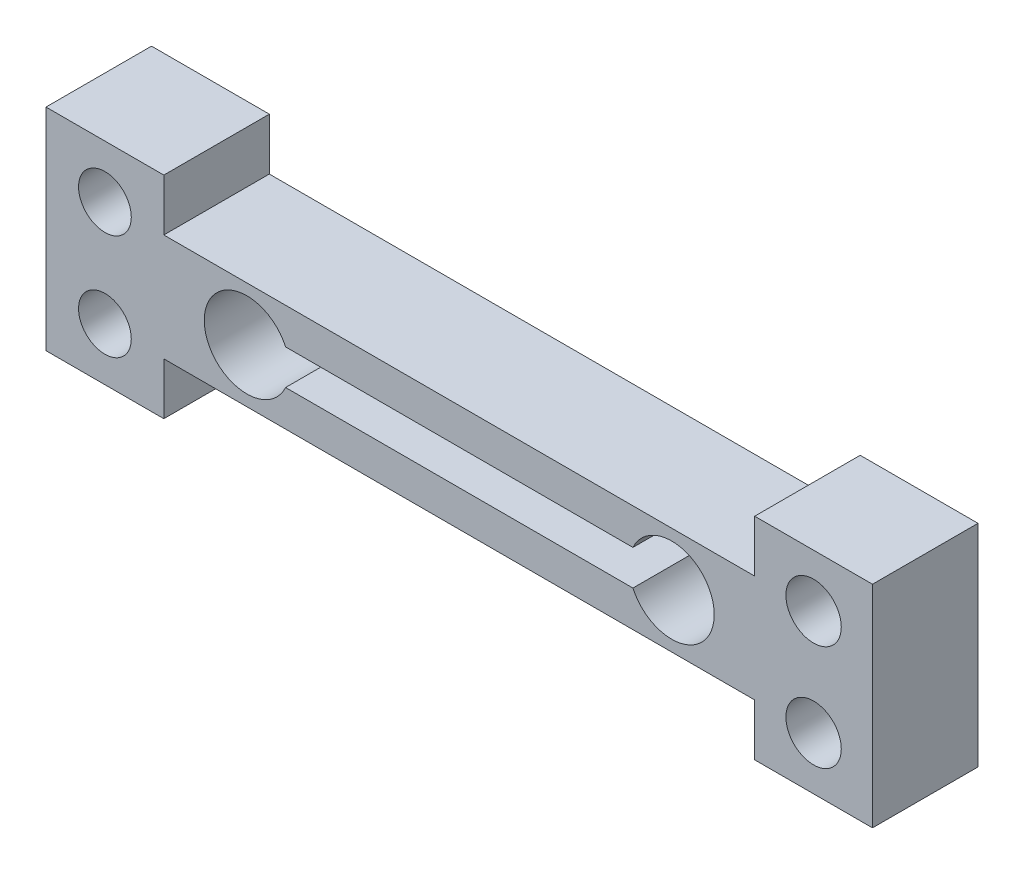
ISO-10303-21;
HEADER;
FILE_DESCRIPTION(('STEP AP214'),'2;1');
FILE_NAME('part.step','',(''),(''),'','','');
FILE_SCHEMA(('AUTOMOTIVE_DESIGN { 1 0 10303 214 1 1 1 1 }'));
ENDSEC;
DATA;
#1=APPLICATION_CONTEXT('core data for automotive mechanical design processes');
#2=APPLICATION_PROTOCOL_DEFINITION('international standard','automotive_design',2000,#1);
#3=PRODUCT_CONTEXT('',#1,'mechanical');
#4=PRODUCT('Part','Part','',(#3));
#5=PRODUCT_RELATED_PRODUCT_CATEGORY('part','',(#4));
#6=PRODUCT_DEFINITION_FORMATION('','',#4);
#7=PRODUCT_DEFINITION_CONTEXT('part definition',#1,'design');
#8=PRODUCT_DEFINITION('design','',#6,#7);
#9=PRODUCT_DEFINITION_SHAPE('','',#8);
#10=(LENGTH_UNIT() NAMED_UNIT(*) SI_UNIT(.MILLI.,.METRE.));
#11=(NAMED_UNIT(*) PLANE_ANGLE_UNIT() SI_UNIT($,.RADIAN.));
#12=(NAMED_UNIT(*) SI_UNIT($,.STERADIAN.) SOLID_ANGLE_UNIT());
#13=UNCERTAINTY_MEASURE_WITH_UNIT(LENGTH_MEASURE(1.E-05),#10,'distance_accuracy_value','');
#14=(GEOMETRIC_REPRESENTATION_CONTEXT(3) GLOBAL_UNCERTAINTY_ASSIGNED_CONTEXT((#13)) GLOBAL_UNIT_ASSIGNED_CONTEXT((#10,
#11,#12)) REPRESENTATION_CONTEXT('',''));
#15=CARTESIAN_POINT('',(0.,0.,0.));
#16=DIRECTION('',(0.,0.,1.));
#17=DIRECTION('',(1.,0.,0.));
#18=AXIS2_PLACEMENT_3D('',#15,#16,#17);
#19=CARTESIAN_POINT('',(0.,0.,3.));
#20=DIRECTION('',(0.,0.,1.));
#21=DIRECTION('',(1.,0.,0.));
#22=AXIS2_PLACEMENT_3D('',#19,#20,#21);
#23=PLANE('',#22);
#24=CARTESIAN_POINT('',(8.07,0.,3.));
#25=DIRECTION('',(0.,0.,1.));
#26=DIRECTION('',(1.,0.,0.));
#27=AXIS2_PLACEMENT_3D('',#24,#25,#26);
#28=CIRCLE('',#27,2.42);
#29=CARTESIAN_POINT('',(10.2737241206648,1.,3.));
#30=VERTEX_POINT('',#29);
#31=CARTESIAN_POINT('',(10.2737241206648,-1.,3.));
#32=VERTEX_POINT('',#31);
#33=EDGE_CURVE('E56',#30,#32,#28,.T.);
#34=ORIENTED_EDGE('',*,*,#33,.F.);
#35=DIRECTION('',(-1.,0.,0.));
#36=VECTOR('',#35,1.);
#37=CARTESIAN_POINT('',(10.2737241206648,1.,3.));
#38=LINE('',#37,#36);
#39=CARTESIAN_POINT('',(30.0262758793352,1.,3.));
#40=VERTEX_POINT('',#39);
#41=EDGE_CURVE('E172',#40,#30,#38,.T.);
#42=ORIENTED_EDGE('',*,*,#41,.F.);
#43=CARTESIAN_POINT('',(32.23,0.,3.));
#44=DIRECTION('',(0.,0.,1.));
#45=DIRECTION('',(1.,0.,0.));
#46=AXIS2_PLACEMENT_3D('',#43,#44,#45);
#47=CIRCLE('',#46,2.42);
#48=CARTESIAN_POINT('',(30.0262758793352,-0.999999999999999,3.));
#49=VERTEX_POINT('',#48);
#50=EDGE_CURVE('E175',#49,#40,#47,.T.);
#51=ORIENTED_EDGE('',*,*,#50,.F.);
#52=DIRECTION('',(1.,0.,0.));
#53=VECTOR('',#52,1.);
#54=CARTESIAN_POINT('',(10.2737241206648,-1.,3.));
#55=LINE('',#54,#53);
#56=EDGE_CURVE('E181',#32,#49,#55,.T.);
#57=ORIENTED_EDGE('',*,*,#56,.F.);
#58=EDGE_LOOP('',(#34,#42,#51,#57));
#59=FACE_BOUND('',#58,.T.);
#60=CARTESIAN_POINT('',(0.,3.,3.));
#61=DIRECTION('',(0.,0.,1.));
#62=DIRECTION('',(1.,0.,0.));
#63=AXIS2_PLACEMENT_3D('',#60,#61,#62);
#64=CIRCLE('',#63,1.5);
#65=CARTESIAN_POINT('',(1.5,3.,3.));
#66=VERTEX_POINT('',#65);
#67=EDGE_CURVE('E197',#66,#66,#64,.T.);
#68=ORIENTED_EDGE('',*,*,#67,.F.);
#69=EDGE_LOOP('',(#68));
#70=FACE_BOUND('',#69,.T.);
#71=CARTESIAN_POINT('',(40.3,3.,3.));
#72=DIRECTION('',(0.,0.,1.));
#73=DIRECTION('',(1.,0.,0.));
#74=AXIS2_PLACEMENT_3D('',#71,#72,#73);
#75=CIRCLE('',#74,1.575);
#76=CARTESIAN_POINT('',(41.875,3.,3.));
#77=VERTEX_POINT('',#76);
#78=EDGE_CURVE('E209',#77,#77,#75,.T.);
#79=ORIENTED_EDGE('',*,*,#78,.F.);
#80=EDGE_LOOP('',(#79));
#81=FACE_BOUND('',#80,.T.);
#82=DIRECTION('',(0.,1.,0.));
#83=VECTOR('',#82,1.);
#84=CARTESIAN_POINT('',(3.35,-3.05,3.));
#85=LINE('',#84,#83);
#86=CARTESIAN_POINT('',(3.35,-6.,3.));
#87=VERTEX_POINT('',#86);
#88=CARTESIAN_POINT('',(3.35,-3.05,3.));
#89=VERTEX_POINT('',#88);
#90=EDGE_CURVE('E215',#87,#89,#85,.T.);
#91=ORIENTED_EDGE('',*,*,#90,.T.);
#92=DIRECTION('',(1.,0.,0.));
#93=VECTOR('',#92,1.);
#94=CARTESIAN_POINT('',(3.35,-3.05,3.));
#95=LINE('',#94,#93);
#96=CARTESIAN_POINT('',(36.95,-3.05,3.));
#97=VERTEX_POINT('',#96);
#98=EDGE_CURVE('E218',#89,#97,#95,.T.);
#99=ORIENTED_EDGE('',*,*,#98,.T.);
#100=DIRECTION('',(0.,-1.,0.));
#101=VECTOR('',#100,1.);
#102=CARTESIAN_POINT('',(36.95,-6.,3.));
#103=LINE('',#102,#101);
#104=CARTESIAN_POINT('',(36.95,-6.,3.));
#105=VERTEX_POINT('',#104);
#106=EDGE_CURVE('E221',#97,#105,#103,.T.);
#107=ORIENTED_EDGE('',*,*,#106,.T.);
#108=DIRECTION('',(1.,0.,0.));
#109=VECTOR('',#108,1.);
#110=CARTESIAN_POINT('',(43.65,-6.,3.));
#111=LINE('',#110,#109);
#112=CARTESIAN_POINT('',(43.65,-6.,3.));
#113=VERTEX_POINT('',#112);
#114=EDGE_CURVE('E223',#105,#113,#111,.T.);
#115=ORIENTED_EDGE('',*,*,#114,.T.);
#116=DIRECTION('',(0.,1.,0.));
#117=VECTOR('',#116,1.);
#118=CARTESIAN_POINT('',(43.65,-6.,3.));
#119=LINE('',#118,#117);
#120=CARTESIAN_POINT('',(43.65,6.,3.));
#121=VERTEX_POINT('',#120);
#122=EDGE_CURVE('E225',#113,#121,#119,.T.);
#123=ORIENTED_EDGE('',*,*,#122,.T.);
#124=DIRECTION('',(-1.,0.,0.));
#125=VECTOR('',#124,1.);
#126=CARTESIAN_POINT('',(43.65,6.,3.));
#127=LINE('',#126,#125);
#128=CARTESIAN_POINT('',(36.95,6.,3.));
#129=VERTEX_POINT('',#128);
#130=EDGE_CURVE('E227',#121,#129,#127,.T.);
#131=ORIENTED_EDGE('',*,*,#130,.T.);
#132=DIRECTION('',(0.,-1.,0.));
#133=VECTOR('',#132,1.);
#134=CARTESIAN_POINT('',(36.95,3.05,3.));
#135=LINE('',#134,#133);
#136=CARTESIAN_POINT('',(36.95,3.05,3.));
#137=VERTEX_POINT('',#136);
#138=EDGE_CURVE('E229',#129,#137,#135,.T.);
#139=ORIENTED_EDGE('',*,*,#138,.T.);
#140=DIRECTION('',(-1.,0.,0.));
#141=VECTOR('',#140,1.);
#142=CARTESIAN_POINT('',(3.35,3.05,3.));
#143=LINE('',#142,#141);
#144=CARTESIAN_POINT('',(3.35,3.05,3.));
#145=VERTEX_POINT('',#144);
#146=EDGE_CURVE('E231',#137,#145,#143,.T.);
#147=ORIENTED_EDGE('',*,*,#146,.T.);
#148=DIRECTION('',(0.,1.,0.));
#149=VECTOR('',#148,1.);
#150=CARTESIAN_POINT('',(3.35,6.,3.));
#151=LINE('',#150,#149);
#152=CARTESIAN_POINT('',(3.35,6.,3.));
#153=VERTEX_POINT('',#152);
#154=EDGE_CURVE('E233',#145,#153,#151,.T.);
#155=ORIENTED_EDGE('',*,*,#154,.T.);
#156=DIRECTION('',(-1.,0.,0.));
#157=VECTOR('',#156,1.);
#158=CARTESIAN_POINT('',(-3.35,6.,3.));
#159=LINE('',#158,#157);
#160=CARTESIAN_POINT('',(-3.35,6.,3.));
#161=VERTEX_POINT('',#160);
#162=EDGE_CURVE('E235',#153,#161,#159,.T.);
#163=ORIENTED_EDGE('',*,*,#162,.T.);
#164=DIRECTION('',(0.,-1.,0.));
#165=VECTOR('',#164,1.);
#166=CARTESIAN_POINT('',(-3.35,6.,3.));
#167=LINE('',#166,#165);
#168=CARTESIAN_POINT('',(-3.35,-6.,3.));
#169=VERTEX_POINT('',#168);
#170=EDGE_CURVE('E237',#161,#169,#167,.T.);
#171=ORIENTED_EDGE('',*,*,#170,.T.);
#172=DIRECTION('',(1.,0.,0.));
#173=VECTOR('',#172,1.);
#174=CARTESIAN_POINT('',(-3.35,-6.,3.));
#175=LINE('',#174,#173);
#176=EDGE_CURVE('E239',#169,#87,#175,.T.);
#177=ORIENTED_EDGE('',*,*,#176,.T.);
#178=EDGE_LOOP('',(#91,#99,#107,#115,#123,#131,#139,#147,#155,#163,#171,#177));
#179=FACE_BOUND('',#178,.T.);
#180=CARTESIAN_POINT('',(40.3,-3.,3.));
#181=DIRECTION('',(0.,0.,1.));
#182=DIRECTION('',(1.,0.,0.));
#183=AXIS2_PLACEMENT_3D('',#180,#181,#182);
#184=CIRCLE('',#183,1.575);
#185=CARTESIAN_POINT('',(41.875,-3.,3.));
#186=VERTEX_POINT('',#185);
#187=EDGE_CURVE('E203',#186,#186,#184,.T.);
#188=ORIENTED_EDGE('',*,*,#187,.F.);
#189=EDGE_LOOP('',(#188));
#190=FACE_BOUND('',#189,.T.);
#191=CARTESIAN_POINT('',(0.,-3.,3.));
#192=DIRECTION('',(0.,0.,1.));
#193=DIRECTION('',(1.,0.,0.));
#194=AXIS2_PLACEMENT_3D('',#191,#192,#193);
#195=CIRCLE('',#194,1.5);
#196=CARTESIAN_POINT('',(1.5,-3.,3.));
#197=VERTEX_POINT('',#196);
#198=EDGE_CURVE('E191',#197,#197,#195,.T.);
#199=ORIENTED_EDGE('',*,*,#198,.F.);
#200=EDGE_LOOP('',(#199));
#201=FACE_BOUND('',#200,.T.);
#202=ADVANCED_FACE('F41',(#59,#70,#81,#179,#190,#201),#23,.T.);
#203=CARTESIAN_POINT('',(0.,0.,-3.));
#204=DIRECTION('',(0.,0.,1.));
#205=DIRECTION('',(1.,0.,0.));
#206=AXIS2_PLACEMENT_3D('',#203,#204,#205);
#207=PLANE('',#206);
#208=DIRECTION('',(-1.,0.,0.));
#209=VECTOR('',#208,1.);
#210=CARTESIAN_POINT('',(10.2737241206648,1.,-3.));
#211=LINE('',#210,#209);
#212=CARTESIAN_POINT('',(30.0262758793352,1.,-3.));
#213=VERTEX_POINT('',#212);
#214=CARTESIAN_POINT('',(10.2737241206648,1.,-3.));
#215=VERTEX_POINT('',#214);
#216=EDGE_CURVE('E162',#213,#215,#211,.T.);
#217=ORIENTED_EDGE('',*,*,#216,.T.);
#218=CARTESIAN_POINT('',(8.07,0.,-3.));
#219=DIRECTION('',(0.,0.,1.));
#220=DIRECTION('',(1.,0.,0.));
#221=AXIS2_PLACEMENT_3D('',#218,#219,#220);
#222=CIRCLE('',#221,2.42);
#223=CARTESIAN_POINT('',(10.2737241206648,-1.,-3.));
#224=VERTEX_POINT('',#223);
#225=EDGE_CURVE('E156',#215,#224,#222,.T.);
#226=ORIENTED_EDGE('',*,*,#225,.T.);
#227=DIRECTION('',(1.,0.,0.));
#228=VECTOR('',#227,1.);
#229=CARTESIAN_POINT('',(10.2737241206648,-1.,-3.));
#230=LINE('',#229,#228);
#231=CARTESIAN_POINT('',(30.0262758793352,-1.,-3.));
#232=VERTEX_POINT('',#231);
#233=EDGE_CURVE('E165',#224,#232,#230,.T.);
#234=ORIENTED_EDGE('',*,*,#233,.T.);
#235=CARTESIAN_POINT('',(32.23,0.,-3.));
#236=DIRECTION('',(0.,0.,1.));
#237=DIRECTION('',(1.,0.,0.));
#238=AXIS2_PLACEMENT_3D('',#235,#236,#237);
#239=CIRCLE('',#238,2.42);
#240=EDGE_CURVE('E64',#232,#213,#239,.T.);
#241=ORIENTED_EDGE('',*,*,#240,.T.);
#242=EDGE_LOOP('',(#217,#226,#234,#241));
#243=FACE_BOUND('',#242,.T.);
#244=DIRECTION('',(0.,1.,0.));
#245=VECTOR('',#244,1.);
#246=CARTESIAN_POINT('',(3.35,-3.05,-3.));
#247=LINE('',#246,#245);
#248=CARTESIAN_POINT('',(3.35,-6.,-3.));
#249=VERTEX_POINT('',#248);
#250=CARTESIAN_POINT('',(3.35,-3.05,-3.));
#251=VERTEX_POINT('',#250);
#252=EDGE_CURVE('E212',#249,#251,#247,.T.);
#253=ORIENTED_EDGE('',*,*,#252,.F.);
#254=DIRECTION('',(1.,0.,0.));
#255=VECTOR('',#254,1.);
#256=CARTESIAN_POINT('',(-3.35,-6.,-3.));
#257=LINE('',#256,#255);
#258=CARTESIAN_POINT('',(-3.35,-6.,-3.));
#259=VERTEX_POINT('',#258);
#260=EDGE_CURVE('E219',#259,#249,#257,.T.);
#261=ORIENTED_EDGE('',*,*,#260,.F.);
#262=DIRECTION('',(0.,-1.,0.));
#263=VECTOR('',#262,1.);
#264=CARTESIAN_POINT('',(-3.35,6.,-3.));
#265=LINE('',#264,#263);
#266=CARTESIAN_POINT('',(-3.35,6.,-3.));
#267=VERTEX_POINT('',#266);
#268=EDGE_CURVE('E262',#267,#259,#265,.T.);
#269=ORIENTED_EDGE('',*,*,#268,.F.);
#270=DIRECTION('',(-1.,0.,0.));
#271=VECTOR('',#270,1.);
#272=CARTESIAN_POINT('',(-3.35,6.,-3.));
#273=LINE('',#272,#271);
#274=CARTESIAN_POINT('',(3.35,6.,-3.));
#275=VERTEX_POINT('',#274);
#276=EDGE_CURVE('E260',#275,#267,#273,.T.);
#277=ORIENTED_EDGE('',*,*,#276,.F.);
#278=DIRECTION('',(0.,1.,0.));
#279=VECTOR('',#278,1.);
#280=CARTESIAN_POINT('',(3.35,6.,-3.));
#281=LINE('',#280,#279);
#282=CARTESIAN_POINT('',(3.35,3.05,-3.));
#283=VERTEX_POINT('',#282);
#284=EDGE_CURVE('E258',#283,#275,#281,.T.);
#285=ORIENTED_EDGE('',*,*,#284,.F.);
#286=DIRECTION('',(-1.,0.,0.));
#287=VECTOR('',#286,1.);
#288=CARTESIAN_POINT('',(3.35,3.05,-3.));
#289=LINE('',#288,#287);
#290=CARTESIAN_POINT('',(36.95,3.05,-3.));
#291=VERTEX_POINT('',#290);
#292=EDGE_CURVE('E256',#291,#283,#289,.T.);
#293=ORIENTED_EDGE('',*,*,#292,.F.);
#294=DIRECTION('',(0.,-1.,0.));
#295=VECTOR('',#294,1.);
#296=CARTESIAN_POINT('',(36.95,3.05,-3.));
#297=LINE('',#296,#295);
#298=CARTESIAN_POINT('',(36.95,6.,-3.));
#299=VERTEX_POINT('',#298);
#300=EDGE_CURVE('E254',#299,#291,#297,.T.);
#301=ORIENTED_EDGE('',*,*,#300,.F.);
#302=DIRECTION('',(-1.,0.,0.));
#303=VECTOR('',#302,1.);
#304=CARTESIAN_POINT('',(43.65,6.,-3.));
#305=LINE('',#304,#303);
#306=CARTESIAN_POINT('',(43.65,6.,-3.));
#307=VERTEX_POINT('',#306);
#308=EDGE_CURVE('E252',#307,#299,#305,.T.);
#309=ORIENTED_EDGE('',*,*,#308,.F.);
#310=DIRECTION('',(0.,1.,0.));
#311=VECTOR('',#310,1.);
#312=CARTESIAN_POINT('',(43.65,-6.,-3.));
#313=LINE('',#312,#311);
#314=CARTESIAN_POINT('',(43.65,-6.,-3.));
#315=VERTEX_POINT('',#314);
#316=EDGE_CURVE('E250',#315,#307,#313,.T.);
#317=ORIENTED_EDGE('',*,*,#316,.F.);
#318=DIRECTION('',(1.,0.,0.));
#319=VECTOR('',#318,1.);
#320=CARTESIAN_POINT('',(43.65,-6.,-3.));
#321=LINE('',#320,#319);
#322=CARTESIAN_POINT('',(36.95,-6.,-3.));
#323=VERTEX_POINT('',#322);
#324=EDGE_CURVE('E248',#323,#315,#321,.T.);
#325=ORIENTED_EDGE('',*,*,#324,.F.);
#326=DIRECTION('',(0.,-1.,0.));
#327=VECTOR('',#326,1.);
#328=CARTESIAN_POINT('',(36.95,-6.,-3.));
#329=LINE('',#328,#327);
#330=CARTESIAN_POINT('',(36.95,-3.05,-3.));
#331=VERTEX_POINT('',#330);
#332=EDGE_CURVE('E246',#331,#323,#329,.T.);
#333=ORIENTED_EDGE('',*,*,#332,.F.);
#334=DIRECTION('',(1.,0.,0.));
#335=VECTOR('',#334,1.);
#336=CARTESIAN_POINT('',(3.35,-3.05,-3.));
#337=LINE('',#336,#335);
#338=EDGE_CURVE('E244',#251,#331,#337,.T.);
#339=ORIENTED_EDGE('',*,*,#338,.F.);
#340=EDGE_LOOP('',(#253,#261,#269,#277,#285,#293,#301,#309,#317,#325,#333,#339));
#341=FACE_BOUND('',#340,.T.);
#342=CARTESIAN_POINT('',(40.3,3.,-3.));
#343=DIRECTION('',(0.,0.,1.));
#344=DIRECTION('',(1.,0.,0.));
#345=AXIS2_PLACEMENT_3D('',#342,#343,#344);
#346=CIRCLE('',#345,1.575);
#347=CARTESIAN_POINT('',(41.875,3.,-3.));
#348=VERTEX_POINT('',#347);
#349=EDGE_CURVE('E206',#348,#348,#346,.T.);
#350=ORIENTED_EDGE('',*,*,#349,.T.);
#351=EDGE_LOOP('',(#350));
#352=FACE_BOUND('',#351,.T.);
#353=CARTESIAN_POINT('',(40.3,-3.,-3.));
#354=DIRECTION('',(0.,0.,1.));
#355=DIRECTION('',(1.,0.,0.));
#356=AXIS2_PLACEMENT_3D('',#353,#354,#355);
#357=CIRCLE('',#356,1.575);
#358=CARTESIAN_POINT('',(41.875,-3.,-3.));
#359=VERTEX_POINT('',#358);
#360=EDGE_CURVE('E200',#359,#359,#357,.T.);
#361=ORIENTED_EDGE('',*,*,#360,.T.);
#362=EDGE_LOOP('',(#361));
#363=FACE_BOUND('',#362,.T.);
#364=CARTESIAN_POINT('',(0.,3.,-3.));
#365=DIRECTION('',(0.,0.,1.));
#366=DIRECTION('',(1.,0.,0.));
#367=AXIS2_PLACEMENT_3D('',#364,#365,#366);
#368=CIRCLE('',#367,1.5);
#369=CARTESIAN_POINT('',(1.5,3.,-3.));
#370=VERTEX_POINT('',#369);
#371=EDGE_CURVE('E194',#370,#370,#368,.T.);
#372=ORIENTED_EDGE('',*,*,#371,.T.);
#373=EDGE_LOOP('',(#372));
#374=FACE_BOUND('',#373,.T.);
#375=CARTESIAN_POINT('',(0.,-3.,-3.));
#376=DIRECTION('',(0.,0.,1.));
#377=DIRECTION('',(1.,0.,0.));
#378=AXIS2_PLACEMENT_3D('',#375,#376,#377);
#379=CIRCLE('',#378,1.5);
#380=CARTESIAN_POINT('',(1.5,-3.,-3.));
#381=VERTEX_POINT('',#380);
#382=EDGE_CURVE('E187',#381,#381,#379,.T.);
#383=ORIENTED_EDGE('',*,*,#382,.T.);
#384=EDGE_LOOP('',(#383));
#385=FACE_BOUND('',#384,.T.);
#386=ADVANCED_FACE('F169',(#243,#341,#352,#363,#374,#385),#207,.F.);
#387=CARTESIAN_POINT('',(3.35,-3.05,3.));
#388=DIRECTION('',(-1.,0.,0.));
#389=DIRECTION('',(0.,-1.,0.));
#390=AXIS2_PLACEMENT_3D('',#387,#388,#389);
#391=PLANE('',#390);
#392=ORIENTED_EDGE('',*,*,#252,.T.);
#393=DIRECTION('',(0.,0.,-1.));
#394=VECTOR('',#393,1.);
#395=CARTESIAN_POINT('',(3.35,-3.05,3.));
#396=LINE('',#395,#394);
#397=EDGE_CURVE('E11',#89,#251,#396,.T.);
#398=ORIENTED_EDGE('',*,*,#397,.F.);
#399=ORIENTED_EDGE('',*,*,#90,.F.);
#400=DIRECTION('',(0.,0.,-1.));
#401=VECTOR('',#400,1.);
#402=CARTESIAN_POINT('',(3.35,-6.,3.));
#403=LINE('',#402,#401);
#404=EDGE_CURVE('E241',#87,#249,#403,.T.);
#405=ORIENTED_EDGE('',*,*,#404,.T.);
#406=EDGE_LOOP('',(#392,#398,#399,#405));
#407=FACE_BOUND('',#406,.T.);
#408=ADVANCED_FACE('F43',(#407),#391,.F.);
#409=CARTESIAN_POINT('',(3.35,-3.05,3.));
#410=DIRECTION('',(0.,1.,0.));
#411=DIRECTION('',(-1.,0.,0.));
#412=AXIS2_PLACEMENT_3D('',#409,#410,#411);
#413=PLANE('',#412);
#414=ORIENTED_EDGE('',*,*,#338,.T.);
#415=DIRECTION('',(0.,0.,-1.));
#416=VECTOR('',#415,1.);
#417=CARTESIAN_POINT('',(36.95,-3.05,3.));
#418=LINE('',#417,#416);
#419=EDGE_CURVE('E49',#97,#331,#418,.T.);
#420=ORIENTED_EDGE('',*,*,#419,.F.);
#421=ORIENTED_EDGE('',*,*,#98,.F.);
#422=ORIENTED_EDGE('',*,*,#397,.T.);
#423=EDGE_LOOP('',(#414,#420,#421,#422));
#424=FACE_BOUND('',#423,.T.);
#425=ADVANCED_FACE('F320',(#424),#413,.F.);
#426=CARTESIAN_POINT('',(36.95,-6.,3.));
#427=DIRECTION('',(1.,0.,0.));
#428=DIRECTION('',(0.,1.,0.));
#429=AXIS2_PLACEMENT_3D('',#426,#427,#428);
#430=PLANE('',#429);
#431=ORIENTED_EDGE('',*,*,#332,.T.);
#432=DIRECTION('',(0.,0.,-1.));
#433=VECTOR('',#432,1.);
#434=CARTESIAN_POINT('',(36.95,-6.,3.));
#435=LINE('',#434,#433);
#436=EDGE_CURVE('E291',#105,#323,#435,.T.);
#437=ORIENTED_EDGE('',*,*,#436,.F.);
#438=ORIENTED_EDGE('',*,*,#106,.F.);
#439=ORIENTED_EDGE('',*,*,#419,.T.);
#440=EDGE_LOOP('',(#431,#437,#438,#439));
#441=FACE_BOUND('',#440,.T.);
#442=ADVANCED_FACE('F298',(#441),#430,.F.);
#443=CARTESIAN_POINT('',(43.65,-6.,3.));
#444=DIRECTION('',(0.,1.,0.));
#445=DIRECTION('',(-1.,0.,0.));
#446=AXIS2_PLACEMENT_3D('',#443,#444,#445);
#447=PLANE('',#446);
#448=ORIENTED_EDGE('',*,*,#324,.T.);
#449=DIRECTION('',(0.,0.,-1.));
#450=VECTOR('',#449,1.);
#451=CARTESIAN_POINT('',(43.65,-6.,3.));
#452=LINE('',#451,#450);
#453=EDGE_CURVE('E288',#113,#315,#452,.T.);
#454=ORIENTED_EDGE('',*,*,#453,.F.);
#455=ORIENTED_EDGE('',*,*,#114,.F.);
#456=ORIENTED_EDGE('',*,*,#436,.T.);
#457=EDGE_LOOP('',(#448,#454,#455,#456));
#458=FACE_BOUND('',#457,.T.);
#459=ADVANCED_FACE('F308',(#458),#447,.F.);
#460=CARTESIAN_POINT('',(43.65,-6.,3.));
#461=DIRECTION('',(-1.,0.,0.));
#462=DIRECTION('',(0.,0.,1.));
#463=AXIS2_PLACEMENT_3D('',#460,#461,#462);
#464=PLANE('',#463);
#465=ORIENTED_EDGE('',*,*,#316,.T.);
#466=DIRECTION('',(0.,0.,-1.));
#467=VECTOR('',#466,1.);
#468=CARTESIAN_POINT('',(43.65,6.,3.));
#469=LINE('',#468,#467);
#470=EDGE_CURVE('E285',#121,#307,#469,.T.);
#471=ORIENTED_EDGE('',*,*,#470,.F.);
#472=ORIENTED_EDGE('',*,*,#122,.F.);
#473=ORIENTED_EDGE('',*,*,#453,.T.);
#474=EDGE_LOOP('',(#465,#471,#472,#473));
#475=FACE_BOUND('',#474,.T.);
#476=ADVANCED_FACE('F312',(#475),#464,.F.);
#477=CARTESIAN_POINT('',(43.65,6.,3.));
#478=DIRECTION('',(0.,-1.,0.));
#479=DIRECTION('',(1.,0.,0.));
#480=AXIS2_PLACEMENT_3D('',#477,#478,#479);
#481=PLANE('',#480);
#482=ORIENTED_EDGE('',*,*,#308,.T.);
#483=DIRECTION('',(0.,0.,-1.));
#484=VECTOR('',#483,1.);
#485=CARTESIAN_POINT('',(36.95,6.,3.));
#486=LINE('',#485,#484);
#487=EDGE_CURVE('E282',#129,#299,#486,.T.);
#488=ORIENTED_EDGE('',*,*,#487,.F.);
#489=ORIENTED_EDGE('',*,*,#130,.F.);
#490=ORIENTED_EDGE('',*,*,#470,.T.);
#491=EDGE_LOOP('',(#482,#488,#489,#490));
#492=FACE_BOUND('',#491,.T.);
#493=ADVANCED_FACE('F353',(#492),#481,.F.);
#494=CARTESIAN_POINT('',(36.95,3.05,3.));
#495=DIRECTION('',(1.,0.,0.));
#496=DIRECTION('',(0.,1.,0.));
#497=AXIS2_PLACEMENT_3D('',#494,#495,#496);
#498=PLANE('',#497);
#499=ORIENTED_EDGE('',*,*,#300,.T.);
#500=DIRECTION('',(0.,0.,-1.));
#501=VECTOR('',#500,1.);
#502=CARTESIAN_POINT('',(36.95,3.05,3.));
#503=LINE('',#502,#501);
#504=EDGE_CURVE('E279',#137,#291,#503,.T.);
#505=ORIENTED_EDGE('',*,*,#504,.F.);
#506=ORIENTED_EDGE('',*,*,#138,.F.);
#507=ORIENTED_EDGE('',*,*,#487,.T.);
#508=EDGE_LOOP('',(#499,#505,#506,#507));
#509=FACE_BOUND('',#508,.T.);
#510=ADVANCED_FACE('F351',(#509),#498,.F.);
#511=CARTESIAN_POINT('',(3.35,3.05,3.));
#512=DIRECTION('',(0.,-1.,0.));
#513=DIRECTION('',(1.,0.,0.));
#514=AXIS2_PLACEMENT_3D('',#511,#512,#513);
#515=PLANE('',#514);
#516=ORIENTED_EDGE('',*,*,#292,.T.);
#517=DIRECTION('',(0.,0.,-1.));
#518=VECTOR('',#517,1.);
#519=CARTESIAN_POINT('',(3.35,3.05,3.));
#520=LINE('',#519,#518);
#521=EDGE_CURVE('E276',#145,#283,#520,.T.);
#522=ORIENTED_EDGE('',*,*,#521,.F.);
#523=ORIENTED_EDGE('',*,*,#146,.F.);
#524=ORIENTED_EDGE('',*,*,#504,.T.);
#525=EDGE_LOOP('',(#516,#522,#523,#524));
#526=FACE_BOUND('',#525,.T.);
#527=ADVANCED_FACE('F347',(#526),#515,.F.);
#528=CARTESIAN_POINT('',(3.35,6.,3.));
#529=DIRECTION('',(-1.,0.,0.));
#530=DIRECTION('',(0.,-1.,0.));
#531=AXIS2_PLACEMENT_3D('',#528,#529,#530);
#532=PLANE('',#531);
#533=ORIENTED_EDGE('',*,*,#284,.T.);
#534=DIRECTION('',(0.,0.,-1.));
#535=VECTOR('',#534,1.);
#536=CARTESIAN_POINT('',(3.35,6.,3.));
#537=LINE('',#536,#535);
#538=EDGE_CURVE('E273',#153,#275,#537,.T.);
#539=ORIENTED_EDGE('',*,*,#538,.F.);
#540=ORIENTED_EDGE('',*,*,#154,.F.);
#541=ORIENTED_EDGE('',*,*,#521,.T.);
#542=EDGE_LOOP('',(#533,#539,#540,#541));
#543=FACE_BOUND('',#542,.T.);
#544=ADVANCED_FACE('F342',(#543),#532,.F.);
#545=CARTESIAN_POINT('',(-3.35,6.,3.));
#546=DIRECTION('',(0.,-1.,0.));
#547=DIRECTION('',(0.,0.,-1.));
#548=AXIS2_PLACEMENT_3D('',#545,#546,#547);
#549=PLANE('',#548);
#550=ORIENTED_EDGE('',*,*,#276,.T.);
#551=DIRECTION('',(0.,0.,-1.));
#552=VECTOR('',#551,1.);
#553=CARTESIAN_POINT('',(-3.35,6.,3.));
#554=LINE('',#553,#552);
#555=EDGE_CURVE('E270',#161,#267,#554,.T.);
#556=ORIENTED_EDGE('',*,*,#555,.F.);
#557=ORIENTED_EDGE('',*,*,#162,.F.);
#558=ORIENTED_EDGE('',*,*,#538,.T.);
#559=EDGE_LOOP('',(#550,#556,#557,#558));
#560=FACE_BOUND('',#559,.T.);
#561=ADVANCED_FACE('F336',(#560),#549,.F.);
#562=CARTESIAN_POINT('',(-3.35,6.,3.));
#563=DIRECTION('',(1.,0.,0.));
#564=DIRECTION('',(0.,1.,0.));
#565=AXIS2_PLACEMENT_3D('',#562,#563,#564);
#566=PLANE('',#565);
#567=ORIENTED_EDGE('',*,*,#268,.T.);
#568=DIRECTION('',(0.,0.,-1.));
#569=VECTOR('',#568,1.);
#570=CARTESIAN_POINT('',(-3.35,-6.,3.));
#571=LINE('',#570,#569);
#572=EDGE_CURVE('E267',#169,#259,#571,.T.);
#573=ORIENTED_EDGE('',*,*,#572,.F.);
#574=ORIENTED_EDGE('',*,*,#170,.F.);
#575=ORIENTED_EDGE('',*,*,#555,.T.);
#576=EDGE_LOOP('',(#567,#573,#574,#575));
#577=FACE_BOUND('',#576,.T.);
#578=ADVANCED_FACE('F332',(#577),#566,.F.);
#579=CARTESIAN_POINT('',(-3.35,-6.,3.));
#580=DIRECTION('',(0.,1.,0.));
#581=DIRECTION('',(0.,0.,1.));
#582=AXIS2_PLACEMENT_3D('',#579,#580,#581);
#583=PLANE('',#582);
#584=ORIENTED_EDGE('',*,*,#260,.T.);
#585=ORIENTED_EDGE('',*,*,#404,.F.);
#586=ORIENTED_EDGE('',*,*,#176,.F.);
#587=ORIENTED_EDGE('',*,*,#572,.T.);
#588=EDGE_LOOP('',(#584,#585,#586,#587));
#589=FACE_BOUND('',#588,.T.);
#590=ADVANCED_FACE('F327',(#589),#583,.F.);
#591=CARTESIAN_POINT('',(40.3,3.,3.));
#592=DIRECTION('',(0.,0.,-1.));
#593=DIRECTION('',(-1.,0.,0.));
#594=AXIS2_PLACEMENT_3D('',#591,#592,#593);
#595=CYLINDRICAL_SURFACE('',#594,1.575);
#596=ORIENTED_EDGE('',*,*,#78,.T.);
#597=EDGE_LOOP('',(#596));
#598=FACE_BOUND('',#597,.T.);
#599=ORIENTED_EDGE('',*,*,#349,.F.);
#600=EDGE_LOOP('',(#599));
#601=FACE_BOUND('',#600,.T.);
#602=ADVANCED_FACE('F372',(#598,#601),#595,.F.);
#603=CARTESIAN_POINT('',(40.3,-3.,3.));
#604=DIRECTION('',(0.,0.,-1.));
#605=DIRECTION('',(-1.,0.,0.));
#606=AXIS2_PLACEMENT_3D('',#603,#604,#605);
#607=CYLINDRICAL_SURFACE('',#606,1.575);
#608=ORIENTED_EDGE('',*,*,#187,.T.);
#609=EDGE_LOOP('',(#608));
#610=FACE_BOUND('',#609,.T.);
#611=ORIENTED_EDGE('',*,*,#360,.F.);
#612=EDGE_LOOP('',(#611));
#613=FACE_BOUND('',#612,.T.);
#614=ADVANCED_FACE('F415',(#610,#613),#607,.F.);
#615=CARTESIAN_POINT('',(0.,3.,3.));
#616=DIRECTION('',(0.,0.,-1.));
#617=DIRECTION('',(-1.,0.,0.));
#618=AXIS2_PLACEMENT_3D('',#615,#616,#617);
#619=CYLINDRICAL_SURFACE('',#618,1.5);
#620=ORIENTED_EDGE('',*,*,#67,.T.);
#621=EDGE_LOOP('',(#620));
#622=FACE_BOUND('',#621,.T.);
#623=ORIENTED_EDGE('',*,*,#371,.F.);
#624=EDGE_LOOP('',(#623));
#625=FACE_BOUND('',#624,.T.);
#626=ADVANCED_FACE('F423',(#622,#625),#619,.F.);
#627=CARTESIAN_POINT('',(0.,-3.,3.));
#628=DIRECTION('',(0.,0.,-1.));
#629=DIRECTION('',(-1.,0.,0.));
#630=AXIS2_PLACEMENT_3D('',#627,#628,#629);
#631=CYLINDRICAL_SURFACE('',#630,1.5);
#632=ORIENTED_EDGE('',*,*,#198,.T.);
#633=EDGE_LOOP('',(#632));
#634=FACE_BOUND('',#633,.T.);
#635=ORIENTED_EDGE('',*,*,#382,.F.);
#636=EDGE_LOOP('',(#635));
#637=FACE_BOUND('',#636,.T.);
#638=ADVANCED_FACE('F430',(#634,#637),#631,.F.);
#639=CARTESIAN_POINT('',(8.07,0.,-3.));
#640=DIRECTION('',(0.,0.,1.));
#641=DIRECTION('',(1.,0.,0.));
#642=AXIS2_PLACEMENT_3D('',#639,#640,#641);
#643=CYLINDRICAL_SURFACE('',#642,2.42);
#644=ORIENTED_EDGE('',*,*,#33,.T.);
#645=DIRECTION('',(0.,0.,1.));
#646=VECTOR('',#645,1.);
#647=CARTESIAN_POINT('',(10.2737241206648,-1.,-3.));
#648=LINE('',#647,#646);
#649=EDGE_CURVE('E152',#224,#32,#648,.T.);
#650=ORIENTED_EDGE('',*,*,#649,.F.);
#651=ORIENTED_EDGE('',*,*,#225,.F.);
#652=DIRECTION('',(0.,0.,1.));
#653=VECTOR('',#652,1.);
#654=CARTESIAN_POINT('',(10.2737241206648,1.,-3.));
#655=LINE('',#654,#653);
#656=EDGE_CURVE('E185',#215,#30,#655,.T.);
#657=ORIENTED_EDGE('',*,*,#656,.T.);
#658=EDGE_LOOP('',(#644,#650,#651,#657));
#659=FACE_BOUND('',#658,.T.);
#660=ADVANCED_FACE('F154',(#659),#643,.F.);
#661=CARTESIAN_POINT('',(10.2737241206648,1.,-3.));
#662=DIRECTION('',(0.,1.,0.));
#663=DIRECTION('',(0.,0.,1.));
#664=AXIS2_PLACEMENT_3D('',#661,#662,#663);
#665=PLANE('',#664);
#666=ORIENTED_EDGE('',*,*,#41,.T.);
#667=ORIENTED_EDGE('',*,*,#656,.F.);
#668=ORIENTED_EDGE('',*,*,#216,.F.);
#669=DIRECTION('',(0.,0.,1.));
#670=VECTOR('',#669,1.);
#671=CARTESIAN_POINT('',(30.0262758793352,1.,-3.));
#672=LINE('',#671,#670);
#673=EDGE_CURVE('E188',#213,#40,#672,.T.);
#674=ORIENTED_EDGE('',*,*,#673,.T.);
#675=EDGE_LOOP('',(#666,#667,#668,#674));
#676=FACE_BOUND('',#675,.T.);
#677=ADVANCED_FACE('F450',(#676),#665,.F.);
#678=CARTESIAN_POINT('',(32.23,0.,-3.));
#679=DIRECTION('',(0.,0.,1.));
#680=DIRECTION('',(1.,0.,0.));
#681=AXIS2_PLACEMENT_3D('',#678,#679,#680);
#682=CYLINDRICAL_SURFACE('',#681,2.42);
#683=ORIENTED_EDGE('',*,*,#50,.T.);
#684=ORIENTED_EDGE('',*,*,#673,.F.);
#685=ORIENTED_EDGE('',*,*,#240,.F.);
#686=DIRECTION('',(0.,0.,1.));
#687=VECTOR('',#686,1.);
#688=CARTESIAN_POINT('',(30.0262758793352,-0.999999999999999,-3.));
#689=LINE('',#688,#687);
#690=EDGE_CURVE('E161',#232,#49,#689,.T.);
#691=ORIENTED_EDGE('',*,*,#690,.T.);
#692=EDGE_LOOP('',(#683,#684,#685,#691));
#693=FACE_BOUND('',#692,.T.);
#694=ADVANCED_FACE('F459',(#693),#682,.F.);
#695=CARTESIAN_POINT('',(10.2737241206648,-1.,-3.));
#696=DIRECTION('',(0.,-1.,0.));
#697=DIRECTION('',(0.,0.,-1.));
#698=AXIS2_PLACEMENT_3D('',#695,#696,#697);
#699=PLANE('',#698);
#700=ORIENTED_EDGE('',*,*,#56,.T.);
#701=ORIENTED_EDGE('',*,*,#690,.F.);
#702=ORIENTED_EDGE('',*,*,#233,.F.);
#703=ORIENTED_EDGE('',*,*,#649,.T.);
#704=EDGE_LOOP('',(#700,#701,#702,#703));
#705=FACE_BOUND('',#704,.T.);
#706=ADVANCED_FACE('F166',(#705),#699,.F.);
#707=CLOSED_SHELL('',(#202,#386,#408,#425,#442,#459,#476,#493,#510,#527,#544,#561,#578,#590,
#602,#614,#626,#638,#660,#677,#694,#706));
#708=MANIFOLD_SOLID_BREP('B2',#707);
#709=ADVANCED_BREP_SHAPE_REPRESENTATION('',(#18,#708),#14);
#710=SHAPE_DEFINITION_REPRESENTATION(#9,#709);
ENDSEC;
END-ISO-10303-21;
